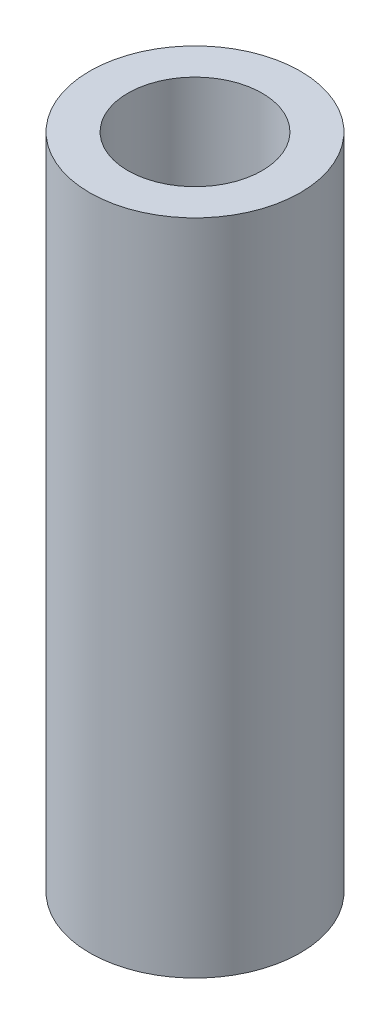
ISO-10303-21;
HEADER;
FILE_DESCRIPTION(('STEP AP214'),'2;1');
FILE_NAME('part.step','',(''),(''),'','','');
FILE_SCHEMA(('AUTOMOTIVE_DESIGN { 1 0 10303 214 1 1 1 1 }'));
ENDSEC;
DATA;
#1=APPLICATION_CONTEXT('core data for automotive mechanical design processes');
#2=APPLICATION_PROTOCOL_DEFINITION('international standard','automotive_design',2000,#1);
#3=PRODUCT_CONTEXT('',#1,'mechanical');
#4=PRODUCT('Part','Part','',(#3));
#5=PRODUCT_RELATED_PRODUCT_CATEGORY('part','',(#4));
#6=PRODUCT_DEFINITION_FORMATION('','',#4);
#7=PRODUCT_DEFINITION_CONTEXT('part definition',#1,'design');
#8=PRODUCT_DEFINITION('design','',#6,#7);
#9=PRODUCT_DEFINITION_SHAPE('','',#8);
#10=(LENGTH_UNIT() NAMED_UNIT(*) SI_UNIT(.MILLI.,.METRE.));
#11=(NAMED_UNIT(*) PLANE_ANGLE_UNIT() SI_UNIT($,.RADIAN.));
#12=(NAMED_UNIT(*) SI_UNIT($,.STERADIAN.) SOLID_ANGLE_UNIT());
#13=UNCERTAINTY_MEASURE_WITH_UNIT(LENGTH_MEASURE(1.E-05),#10,'distance_accuracy_value','');
#14=(GEOMETRIC_REPRESENTATION_CONTEXT(3) GLOBAL_UNCERTAINTY_ASSIGNED_CONTEXT((#13)) GLOBAL_UNIT_ASSIGNED_CONTEXT((#10,
#11,#12)) REPRESENTATION_CONTEXT('',''));
#15=CARTESIAN_POINT('',(0.,0.,0.));
#16=DIRECTION('',(0.,0.,1.));
#17=DIRECTION('',(1.,0.,0.));
#18=AXIS2_PLACEMENT_3D('',#15,#16,#17);
#19=CARTESIAN_POINT('',(0.,25.,0.));
#20=DIRECTION('',(0.,1.,0.));
#21=DIRECTION('',(0.,0.,1.));
#22=AXIS2_PLACEMENT_3D('',#19,#20,#21);
#23=PLANE('',#22);
#24=CARTESIAN_POINT('',(0.,25.,0.));
#25=DIRECTION('',(0.,1.,0.));
#26=DIRECTION('',(0.,0.,1.));
#27=AXIS2_PLACEMENT_3D('',#24,#25,#26);
#28=CIRCLE('',#27,4.);
#29=CARTESIAN_POINT('',(0.,25.,4.));
#30=VERTEX_POINT('',#29);
#31=EDGE_CURVE('E10',#30,#30,#28,.T.);
#32=ORIENTED_EDGE('',*,*,#31,.T.);
#33=EDGE_LOOP('',(#32));
#34=FACE_BOUND('',#33,.T.);
#35=CARTESIAN_POINT('',(0.,25.,0.));
#36=DIRECTION('',(0.,1.,0.));
#37=DIRECTION('',(0.,0.,1.));
#38=AXIS2_PLACEMENT_3D('',#35,#36,#37);
#39=CIRCLE('',#38,2.55);
#40=CARTESIAN_POINT('',(0.,25.,2.55));
#41=VERTEX_POINT('',#40);
#42=EDGE_CURVE('E50',#41,#41,#39,.T.);
#43=ORIENTED_EDGE('',*,*,#42,.F.);
#44=EDGE_LOOP('',(#43));
#45=FACE_BOUND('',#44,.T.);
#46=ADVANCED_FACE('F36',(#34,#45),#23,.T.);
#47=CARTESIAN_POINT('',(0.,0.,0.));
#48=DIRECTION('',(0.,1.,0.));
#49=DIRECTION('',(0.,0.,1.));
#50=AXIS2_PLACEMENT_3D('',#47,#48,#49);
#51=PLANE('',#50);
#52=CARTESIAN_POINT('',(0.,0.,0.));
#53=DIRECTION('',(0.,1.,0.));
#54=DIRECTION('',(0.,0.,1.));
#55=AXIS2_PLACEMENT_3D('',#52,#53,#54);
#56=CIRCLE('',#55,4.);
#57=CARTESIAN_POINT('',(0.,0.,4.));
#58=VERTEX_POINT('',#57);
#59=EDGE_CURVE('E40',#58,#58,#56,.T.);
#60=ORIENTED_EDGE('',*,*,#59,.F.);
#61=EDGE_LOOP('',(#60));
#62=FACE_BOUND('',#61,.T.);
#63=CARTESIAN_POINT('',(0.,0.,0.));
#64=DIRECTION('',(0.,1.,0.));
#65=DIRECTION('',(0.,0.,1.));
#66=AXIS2_PLACEMENT_3D('',#63,#64,#65);
#67=CIRCLE('',#66,2.55);
#68=CARTESIAN_POINT('',(0.,0.,2.55));
#69=VERTEX_POINT('',#68);
#70=EDGE_CURVE('E52',#69,#69,#67,.T.);
#71=ORIENTED_EDGE('',*,*,#70,.T.);
#72=EDGE_LOOP('',(#71));
#73=FACE_BOUND('',#72,.T.);
#74=ADVANCED_FACE('F65',(#62,#73),#51,.F.);
#75=CARTESIAN_POINT('',(0.,25.,0.));
#76=DIRECTION('',(0.,-1.,0.));
#77=DIRECTION('',(0.,0.,-1.));
#78=AXIS2_PLACEMENT_3D('',#75,#76,#77);
#79=CYLINDRICAL_SURFACE('',#78,4.);
#80=ORIENTED_EDGE('',*,*,#31,.F.);
#81=EDGE_LOOP('',(#80));
#82=FACE_BOUND('',#81,.T.);
#83=ORIENTED_EDGE('',*,*,#59,.T.);
#84=EDGE_LOOP('',(#83));
#85=FACE_BOUND('',#84,.T.);
#86=ADVANCED_FACE('F38',(#82,#85),#79,.T.);
#87=CARTESIAN_POINT('',(0.,25.,0.));
#88=DIRECTION('',(0.,-1.,0.));
#89=DIRECTION('',(0.,0.,-1.));
#90=AXIS2_PLACEMENT_3D('',#87,#88,#89);
#91=CYLINDRICAL_SURFACE('',#90,2.55);
#92=ORIENTED_EDGE('',*,*,#42,.T.);
#93=EDGE_LOOP('',(#92));
#94=FACE_BOUND('',#93,.T.);
#95=ORIENTED_EDGE('',*,*,#70,.F.);
#96=EDGE_LOOP('',(#95));
#97=FACE_BOUND('',#96,.T.);
#98=ADVANCED_FACE('F61',(#94,#97),#91,.F.);
#99=CLOSED_SHELL('',(#46,#74,#86,#98));
#100=MANIFOLD_SOLID_BREP('B2',#99);
#101=ADVANCED_BREP_SHAPE_REPRESENTATION('',(#18,#100),#14);
#102=SHAPE_DEFINITION_REPRESENTATION(#9,#101);
ENDSEC;
END-ISO-10303-21;
